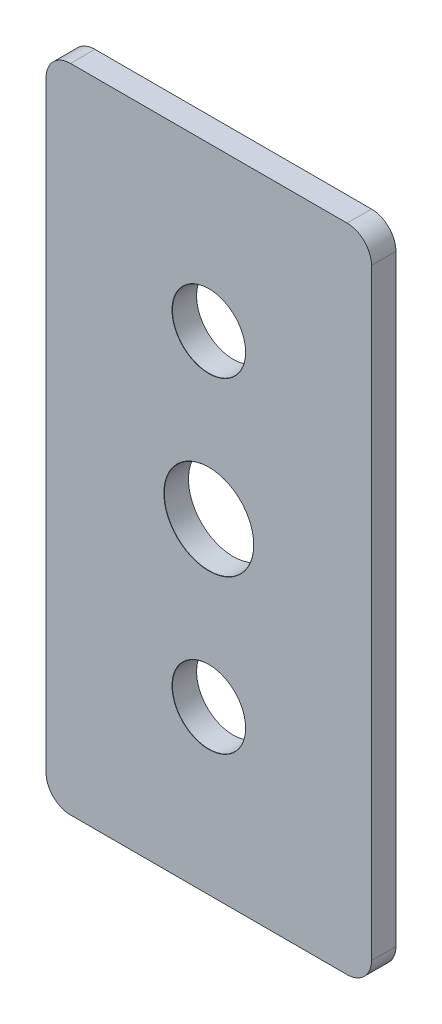
ISO-10303-21;
HEADER;
FILE_DESCRIPTION(('STEP AP214'),'2;1');
FILE_NAME('part.step','',(''),(''),'','','');
FILE_SCHEMA(('AUTOMOTIVE_DESIGN { 1 0 10303 214 1 1 1 1 }'));
ENDSEC;
DATA;
#1=APPLICATION_CONTEXT('core data for automotive mechanical design processes');
#2=APPLICATION_PROTOCOL_DEFINITION('international standard','automotive_design',2000,#1);
#3=PRODUCT_CONTEXT('',#1,'mechanical');
#4=PRODUCT('Part','Part','',(#3));
#5=PRODUCT_RELATED_PRODUCT_CATEGORY('part','',(#4));
#6=PRODUCT_DEFINITION_FORMATION('','',#4);
#7=PRODUCT_DEFINITION_CONTEXT('part definition',#1,'design');
#8=PRODUCT_DEFINITION('design','',#6,#7);
#9=PRODUCT_DEFINITION_SHAPE('','',#8);
#10=(LENGTH_UNIT() NAMED_UNIT(*) SI_UNIT(.MILLI.,.METRE.));
#11=(NAMED_UNIT(*) PLANE_ANGLE_UNIT() SI_UNIT($,.RADIAN.));
#12=(NAMED_UNIT(*) SI_UNIT($,.STERADIAN.) SOLID_ANGLE_UNIT());
#13=UNCERTAINTY_MEASURE_WITH_UNIT(LENGTH_MEASURE(1.E-05),#10,'distance_accuracy_value','');
#14=(GEOMETRIC_REPRESENTATION_CONTEXT(3) GLOBAL_UNCERTAINTY_ASSIGNED_CONTEXT((#13)) GLOBAL_UNIT_ASSIGNED_CONTEXT((#10,
#11,#12)) REPRESENTATION_CONTEXT('',''));
#15=CARTESIAN_POINT('',(0.,0.,0.));
#16=DIRECTION('',(0.,0.,1.));
#17=DIRECTION('',(1.,0.,0.));
#18=AXIS2_PLACEMENT_3D('',#15,#16,#17);
#19=CARTESIAN_POINT('',(20.,40.,-3.));
#20=DIRECTION('',(1.,0.,0.));
#21=DIRECTION('',(0.,0.,-1.));
#22=AXIS2_PLACEMENT_3D('',#19,#20,#21);
#23=PLANE('',#22);
#24=DIRECTION('',(0.,1.,0.));
#25=VECTOR('',#24,1.);
#26=CARTESIAN_POINT('',(20.,40.,0.));
#27=LINE('',#26,#25);
#28=CARTESIAN_POINT('',(20.,-37.,0.));
#29=VERTEX_POINT('',#28);
#30=CARTESIAN_POINT('',(20.,37.,0.));
#31=VERTEX_POINT('',#30);
#32=EDGE_CURVE('E171',#29,#31,#27,.T.);
#33=ORIENTED_EDGE('',*,*,#32,.F.);
#34=DIRECTION('',(0.,0.,1.));
#35=VECTOR('',#34,1.);
#36=CARTESIAN_POINT('',(20.,-37.,-3.));
#37=LINE('',#36,#35);
#38=CARTESIAN_POINT('',(20.,-37.,-3.));
#39=VERTEX_POINT('',#38);
#40=EDGE_CURVE('E156',#29,#39,#37,.F.);
#41=ORIENTED_EDGE('',*,*,#40,.T.);
#42=DIRECTION('',(0.,1.,0.));
#43=VECTOR('',#42,1.);
#44=CARTESIAN_POINT('',(20.,40.,-3.));
#45=LINE('',#44,#43);
#46=CARTESIAN_POINT('',(20.,37.,-3.));
#47=VERTEX_POINT('',#46);
#48=EDGE_CURVE('E140',#39,#47,#45,.T.);
#49=ORIENTED_EDGE('',*,*,#48,.T.);
#50=DIRECTION('',(0.,0.,1.));
#51=VECTOR('',#50,1.);
#52=CARTESIAN_POINT('',(20.,37.,-3.));
#53=LINE('',#52,#51);
#54=EDGE_CURVE('E153',#47,#31,#53,.T.);
#55=ORIENTED_EDGE('',*,*,#54,.T.);
#56=EDGE_LOOP('',(#33,#41,#49,#55));
#57=FACE_BOUND('',#56,.T.);
#58=ADVANCED_FACE('F48',(#57),#23,.T.);
#59=CARTESIAN_POINT('',(-20.,-40.,-3.));
#60=DIRECTION('',(0.,-1.,0.));
#61=DIRECTION('',(0.,0.,-1.));
#62=AXIS2_PLACEMENT_3D('',#59,#60,#61);
#63=PLANE('',#62);
#64=DIRECTION('',(1.,0.,0.));
#65=VECTOR('',#64,1.);
#66=CARTESIAN_POINT('',(-20.,-40.,-3.));
#67=LINE('',#66,#65);
#68=CARTESIAN_POINT('',(-17.,-40.,-3.));
#69=VERTEX_POINT('',#68);
#70=CARTESIAN_POINT('',(17.,-40.,-3.));
#71=VERTEX_POINT('',#70);
#72=EDGE_CURVE('E142',#69,#71,#67,.T.);
#73=ORIENTED_EDGE('',*,*,#72,.T.);
#74=DIRECTION('',(0.,0.,1.));
#75=VECTOR('',#74,1.);
#76=CARTESIAN_POINT('',(17.,-40.,-3.));
#77=LINE('',#76,#75);
#78=CARTESIAN_POINT('',(17.,-40.,0.));
#79=VERTEX_POINT('',#78);
#80=EDGE_CURVE('E136',#71,#79,#77,.T.);
#81=ORIENTED_EDGE('',*,*,#80,.T.);
#82=DIRECTION('',(1.,0.,0.));
#83=VECTOR('',#82,1.);
#84=CARTESIAN_POINT('',(-20.,-40.,0.));
#85=LINE('',#84,#83);
#86=CARTESIAN_POINT('',(-17.,-40.,0.));
#87=VERTEX_POINT('',#86);
#88=EDGE_CURVE('E118',#87,#79,#85,.T.);
#89=ORIENTED_EDGE('',*,*,#88,.F.);
#90=DIRECTION('',(0.,0.,1.));
#91=VECTOR('',#90,1.);
#92=CARTESIAN_POINT('',(-17.,-40.,-3.));
#93=LINE('',#92,#91);
#94=EDGE_CURVE('E134',#87,#69,#93,.F.);
#95=ORIENTED_EDGE('',*,*,#94,.T.);
#96=EDGE_LOOP('',(#73,#81,#89,#95));
#97=FACE_BOUND('',#96,.T.);
#98=ADVANCED_FACE('F132',(#97),#63,.T.);
#99=CARTESIAN_POINT('',(-20.,40.,-3.));
#100=DIRECTION('',(-1.,0.,0.));
#101=DIRECTION('',(0.,0.,1.));
#102=AXIS2_PLACEMENT_3D('',#99,#100,#101);
#103=PLANE('',#102);
#104=DIRECTION('',(0.,-1.,0.));
#105=VECTOR('',#104,1.);
#106=CARTESIAN_POINT('',(-20.,40.,-3.));
#107=LINE('',#106,#105);
#108=CARTESIAN_POINT('',(-20.,37.,-3.));
#109=VERTEX_POINT('',#108);
#110=CARTESIAN_POINT('',(-20.,-37.,-3.));
#111=VERTEX_POINT('',#110);
#112=EDGE_CURVE('E148',#109,#111,#107,.T.);
#113=ORIENTED_EDGE('',*,*,#112,.T.);
#114=DIRECTION('',(0.,0.,1.));
#115=VECTOR('',#114,1.);
#116=CARTESIAN_POINT('',(-20.,-37.,-3.));
#117=LINE('',#116,#115);
#118=CARTESIAN_POINT('',(-20.,-37.,0.));
#119=VERTEX_POINT('',#118);
#120=EDGE_CURVE('E167',#111,#119,#117,.T.);
#121=ORIENTED_EDGE('',*,*,#120,.T.);
#122=DIRECTION('',(0.,-1.,0.));
#123=VECTOR('',#122,1.);
#124=CARTESIAN_POINT('',(-20.,40.,0.));
#125=LINE('',#124,#123);
#126=CARTESIAN_POINT('',(-20.,37.,0.));
#127=VERTEX_POINT('',#126);
#128=EDGE_CURVE('E124',#127,#119,#125,.T.);
#129=ORIENTED_EDGE('',*,*,#128,.F.);
#130=DIRECTION('',(0.,0.,1.));
#131=VECTOR('',#130,1.);
#132=CARTESIAN_POINT('',(-20.,37.,-3.));
#133=LINE('',#132,#131);
#134=EDGE_CURVE('E163',#127,#109,#133,.F.);
#135=ORIENTED_EDGE('',*,*,#134,.T.);
#136=EDGE_LOOP('',(#113,#121,#129,#135));
#137=FACE_BOUND('',#136,.T.);
#138=ADVANCED_FACE('F216',(#137),#103,.T.);
#139=CARTESIAN_POINT('',(-20.,40.,-3.));
#140=DIRECTION('',(0.,1.,0.));
#141=DIRECTION('',(0.,0.,1.));
#142=AXIS2_PLACEMENT_3D('',#139,#140,#141);
#143=PLANE('',#142);
#144=DIRECTION('',(-1.,0.,0.));
#145=VECTOR('',#144,1.);
#146=CARTESIAN_POINT('',(-20.,40.,-3.));
#147=LINE('',#146,#145);
#148=CARTESIAN_POINT('',(17.,40.,-3.));
#149=VERTEX_POINT('',#148);
#150=CARTESIAN_POINT('',(-17.,40.,-3.));
#151=VERTEX_POINT('',#150);
#152=EDGE_CURVE('E192',#149,#151,#147,.T.);
#153=ORIENTED_EDGE('',*,*,#152,.T.);
#154=DIRECTION('',(0.,0.,1.));
#155=VECTOR('',#154,1.);
#156=CARTESIAN_POINT('',(-17.,40.,-3.));
#157=LINE('',#156,#155);
#158=CARTESIAN_POINT('',(-17.,40.,0.));
#159=VERTEX_POINT('',#158);
#160=EDGE_CURVE('E11',#151,#159,#157,.T.);
#161=ORIENTED_EDGE('',*,*,#160,.T.);
#162=DIRECTION('',(-1.,0.,0.));
#163=VECTOR('',#162,1.);
#164=CARTESIAN_POINT('',(-20.,40.,0.));
#165=LINE('',#164,#163);
#166=CARTESIAN_POINT('',(17.,40.,0.));
#167=VERTEX_POINT('',#166);
#168=EDGE_CURVE('E199',#167,#159,#165,.T.);
#169=ORIENTED_EDGE('',*,*,#168,.F.);
#170=DIRECTION('',(0.,0.,1.));
#171=VECTOR('',#170,1.);
#172=CARTESIAN_POINT('',(17.,40.,-3.));
#173=LINE('',#172,#171);
#174=EDGE_CURVE('E60',#167,#149,#173,.F.);
#175=ORIENTED_EDGE('',*,*,#174,.T.);
#176=EDGE_LOOP('',(#153,#161,#169,#175));
#177=FACE_BOUND('',#176,.T.);
#178=ADVANCED_FACE('F205',(#177),#143,.T.);
#179=CARTESIAN_POINT('',(0.,0.,-3.));
#180=DIRECTION('',(0.,0.,1.));
#181=DIRECTION('',(1.,0.,0.));
#182=AXIS2_PLACEMENT_3D('',#179,#180,#181);
#183=PLANE('',#182);
#184=CARTESIAN_POINT('',(0.,0.,-3.));
#185=DIRECTION('',(0.,0.,1.));
#186=DIRECTION('',(1.,0.,0.));
#187=AXIS2_PLACEMENT_3D('',#184,#185,#186);
#188=CIRCLE('',#187,5.5);
#189=CARTESIAN_POINT('',(5.5,0.,-3.));
#190=VERTEX_POINT('',#189);
#191=EDGE_CURVE('E55',#190,#190,#188,.T.);
#192=ORIENTED_EDGE('',*,*,#191,.T.);
#193=EDGE_LOOP('',(#192));
#194=FACE_BOUND('',#193,.T.);
#195=CARTESIAN_POINT('',(0.,20.,-3.));
#196=DIRECTION('',(0.,0.,1.));
#197=DIRECTION('',(1.,0.,0.));
#198=AXIS2_PLACEMENT_3D('',#195,#196,#197);
#199=CIRCLE('',#198,4.5);
#200=CARTESIAN_POINT('',(4.5,20.,-3.));
#201=VERTEX_POINT('',#200);
#202=EDGE_CURVE('E174',#201,#201,#199,.T.);
#203=ORIENTED_EDGE('',*,*,#202,.T.);
#204=EDGE_LOOP('',(#203));
#205=FACE_BOUND('',#204,.T.);
#206=CARTESIAN_POINT('',(0.,-20.,-3.));
#207=DIRECTION('',(0.,0.,1.));
#208=DIRECTION('',(1.,0.,0.));
#209=AXIS2_PLACEMENT_3D('',#206,#207,#208);
#210=CIRCLE('',#209,4.5);
#211=CARTESIAN_POINT('',(4.5,-20.,-3.));
#212=VERTEX_POINT('',#211);
#213=EDGE_CURVE('E166',#212,#212,#210,.T.);
#214=ORIENTED_EDGE('',*,*,#213,.T.);
#215=EDGE_LOOP('',(#214));
#216=FACE_BOUND('',#215,.T.);
#217=ORIENTED_EDGE('',*,*,#48,.F.);
#218=CARTESIAN_POINT('',(17.,-37.,-3.));
#219=DIRECTION('',(0.,0.,1.));
#220=DIRECTION('',(1.,0.,0.));
#221=AXIS2_PLACEMENT_3D('',#218,#219,#220);
#222=CIRCLE('',#221,3.);
#223=EDGE_CURVE('E165',#39,#71,#222,.F.);
#224=ORIENTED_EDGE('',*,*,#223,.T.);
#225=ORIENTED_EDGE('',*,*,#72,.F.);
#226=CARTESIAN_POINT('',(-17.,-37.,-3.));
#227=DIRECTION('',(0.,0.,1.));
#228=DIRECTION('',(1.,0.,0.));
#229=AXIS2_PLACEMENT_3D('',#226,#227,#228);
#230=CIRCLE('',#229,3.);
#231=EDGE_CURVE('E143',#69,#111,#230,.F.);
#232=ORIENTED_EDGE('',*,*,#231,.T.);
#233=ORIENTED_EDGE('',*,*,#112,.F.);
#234=CARTESIAN_POINT('',(-17.,37.,-3.));
#235=DIRECTION('',(0.,0.,1.));
#236=DIRECTION('',(1.,0.,0.));
#237=AXIS2_PLACEMENT_3D('',#234,#235,#236);
#238=CIRCLE('',#237,3.);
#239=EDGE_CURVE('E65',#109,#151,#238,.F.);
#240=ORIENTED_EDGE('',*,*,#239,.T.);
#241=ORIENTED_EDGE('',*,*,#152,.F.);
#242=CARTESIAN_POINT('',(17.,37.,-3.));
#243=DIRECTION('',(0.,0.,1.));
#244=DIRECTION('',(1.,0.,0.));
#245=AXIS2_PLACEMENT_3D('',#242,#243,#244);
#246=CIRCLE('',#245,3.);
#247=EDGE_CURVE('E158',#149,#47,#246,.F.);
#248=ORIENTED_EDGE('',*,*,#247,.T.);
#249=EDGE_LOOP('',(#217,#224,#225,#232,#233,#240,#241,#248));
#250=FACE_BOUND('',#249,.T.);
#251=ADVANCED_FACE('F208',(#194,#205,#216,#250),#183,.F.);
#252=CARTESIAN_POINT('',(0.,0.,0.));
#253=DIRECTION('',(0.,0.,1.));
#254=DIRECTION('',(1.,0.,0.));
#255=AXIS2_PLACEMENT_3D('',#252,#253,#254);
#256=PLANE('',#255);
#257=CARTESIAN_POINT('',(0.,0.,0.));
#258=DIRECTION('',(0.,0.,1.));
#259=DIRECTION('',(1.,0.,0.));
#260=AXIS2_PLACEMENT_3D('',#257,#258,#259);
#261=CIRCLE('',#260,5.525);
#262=CARTESIAN_POINT('',(5.525,0.,0.));
#263=VERTEX_POINT('',#262);
#264=EDGE_CURVE('E361',#263,#263,#261,.T.);
#265=ORIENTED_EDGE('',*,*,#264,.F.);
#266=EDGE_LOOP('',(#265));
#267=FACE_BOUND('',#266,.T.);
#268=CARTESIAN_POINT('',(0.,20.,0.));
#269=DIRECTION('',(0.,0.,1.));
#270=DIRECTION('',(1.,0.,0.));
#271=AXIS2_PLACEMENT_3D('',#268,#269,#270);
#272=CIRCLE('',#271,4.525);
#273=CARTESIAN_POINT('',(4.525,20.,0.));
#274=VERTEX_POINT('',#273);
#275=EDGE_CURVE('E185',#274,#274,#272,.T.);
#276=ORIENTED_EDGE('',*,*,#275,.F.);
#277=EDGE_LOOP('',(#276));
#278=FACE_BOUND('',#277,.T.);
#279=CARTESIAN_POINT('',(0.,-20.,0.));
#280=DIRECTION('',(0.,0.,1.));
#281=DIRECTION('',(1.,0.,0.));
#282=AXIS2_PLACEMENT_3D('',#279,#280,#281);
#283=CIRCLE('',#282,4.525);
#284=CARTESIAN_POINT('',(4.525,-20.,0.));
#285=VERTEX_POINT('',#284);
#286=EDGE_CURVE('E175',#285,#285,#283,.T.);
#287=ORIENTED_EDGE('',*,*,#286,.F.);
#288=EDGE_LOOP('',(#287));
#289=FACE_BOUND('',#288,.T.);
#290=ORIENTED_EDGE('',*,*,#88,.T.);
#291=CARTESIAN_POINT('',(17.,-37.,0.));
#292=DIRECTION('',(0.,0.,1.));
#293=DIRECTION('',(1.,0.,0.));
#294=AXIS2_PLACEMENT_3D('',#291,#292,#293);
#295=CIRCLE('',#294,3.);
#296=EDGE_CURVE('E127',#79,#29,#295,.T.);
#297=ORIENTED_EDGE('',*,*,#296,.T.);
#298=ORIENTED_EDGE('',*,*,#32,.T.);
#299=CARTESIAN_POINT('',(17.,37.,0.));
#300=DIRECTION('',(0.,0.,1.));
#301=DIRECTION('',(1.,0.,0.));
#302=AXIS2_PLACEMENT_3D('',#299,#300,#301);
#303=CIRCLE('',#302,3.);
#304=EDGE_CURVE('E145',#31,#167,#303,.T.);
#305=ORIENTED_EDGE('',*,*,#304,.T.);
#306=ORIENTED_EDGE('',*,*,#168,.T.);
#307=CARTESIAN_POINT('',(-17.,37.,0.));
#308=DIRECTION('',(0.,0.,1.));
#309=DIRECTION('',(1.,0.,0.));
#310=AXIS2_PLACEMENT_3D('',#307,#308,#309);
#311=CIRCLE('',#310,3.);
#312=EDGE_CURVE('E130',#159,#127,#311,.T.);
#313=ORIENTED_EDGE('',*,*,#312,.T.);
#314=ORIENTED_EDGE('',*,*,#128,.T.);
#315=CARTESIAN_POINT('',(-17.,-37.,0.));
#316=DIRECTION('',(0.,0.,1.));
#317=DIRECTION('',(1.,0.,0.));
#318=AXIS2_PLACEMENT_3D('',#315,#316,#317);
#319=CIRCLE('',#318,3.);
#320=EDGE_CURVE('E116',#119,#87,#319,.T.);
#321=ORIENTED_EDGE('',*,*,#320,.T.);
#322=EDGE_LOOP('',(#290,#297,#298,#305,#306,#313,#314,#321));
#323=FACE_BOUND('',#322,.T.);
#324=ADVANCED_FACE('F119',(#267,#278,#289,#323),#256,.T.);
#325=CARTESIAN_POINT('',(17.,-37.,-3.));
#326=DIRECTION('',(0.,0.,1.));
#327=DIRECTION('',(1.,0.,0.));
#328=AXIS2_PLACEMENT_3D('',#325,#326,#327);
#329=CYLINDRICAL_SURFACE('',#328,3.);
#330=ORIENTED_EDGE('',*,*,#223,.F.);
#331=ORIENTED_EDGE('',*,*,#40,.F.);
#332=ORIENTED_EDGE('',*,*,#296,.F.);
#333=ORIENTED_EDGE('',*,*,#80,.F.);
#334=EDGE_LOOP('',(#330,#331,#332,#333));
#335=FACE_BOUND('',#334,.T.);
#336=ADVANCED_FACE('F212',(#335),#329,.T.);
#337=CARTESIAN_POINT('',(-17.,-37.,-3.));
#338=DIRECTION('',(0.,0.,1.));
#339=DIRECTION('',(1.,0.,0.));
#340=AXIS2_PLACEMENT_3D('',#337,#338,#339);
#341=CYLINDRICAL_SURFACE('',#340,3.);
#342=ORIENTED_EDGE('',*,*,#231,.F.);
#343=ORIENTED_EDGE('',*,*,#94,.F.);
#344=ORIENTED_EDGE('',*,*,#320,.F.);
#345=ORIENTED_EDGE('',*,*,#120,.F.);
#346=EDGE_LOOP('',(#342,#343,#344,#345));
#347=FACE_BOUND('',#346,.T.);
#348=ADVANCED_FACE('F139',(#347),#341,.T.);
#349=CARTESIAN_POINT('',(-17.,37.,-3.));
#350=DIRECTION('',(0.,0.,1.));
#351=DIRECTION('',(1.,0.,0.));
#352=AXIS2_PLACEMENT_3D('',#349,#350,#351);
#353=CYLINDRICAL_SURFACE('',#352,3.);
#354=ORIENTED_EDGE('',*,*,#239,.F.);
#355=ORIENTED_EDGE('',*,*,#134,.F.);
#356=ORIENTED_EDGE('',*,*,#312,.F.);
#357=ORIENTED_EDGE('',*,*,#160,.F.);
#358=EDGE_LOOP('',(#354,#355,#356,#357));
#359=FACE_BOUND('',#358,.T.);
#360=ADVANCED_FACE('F218',(#359),#353,.T.);
#361=CARTESIAN_POINT('',(17.,37.,-3.));
#362=DIRECTION('',(0.,0.,1.));
#363=DIRECTION('',(1.,0.,0.));
#364=AXIS2_PLACEMENT_3D('',#361,#362,#363);
#365=CYLINDRICAL_SURFACE('',#364,3.);
#366=ORIENTED_EDGE('',*,*,#247,.F.);
#367=ORIENTED_EDGE('',*,*,#174,.F.);
#368=ORIENTED_EDGE('',*,*,#304,.F.);
#369=ORIENTED_EDGE('',*,*,#54,.F.);
#370=EDGE_LOOP('',(#366,#367,#368,#369));
#371=FACE_BOUND('',#370,.T.);
#372=ADVANCED_FACE('F49',(#371),#365,.T.);
#373=CARTESIAN_POINT('',(0.,-20.,0.));
#374=DIRECTION('',(0.,0.,1.));
#375=DIRECTION('',(1.,0.,0.));
#376=AXIS2_PLACEMENT_3D('',#373,#374,#375);
#377=CYLINDRICAL_SURFACE('',#376,4.5);
#378=CARTESIAN_POINT('',(0.,-20.,-0.0250000000000059));
#379=DIRECTION('',(0.,0.,1.));
#380=DIRECTION('',(1.,0.,0.));
#381=AXIS2_PLACEMENT_3D('',#378,#379,#380);
#382=CIRCLE('',#381,4.5);
#383=CARTESIAN_POINT('',(4.5,-20.,-0.0250000000000059));
#384=VERTEX_POINT('',#383);
#385=EDGE_CURVE('E172',#384,#384,#382,.T.);
#386=ORIENTED_EDGE('',*,*,#385,.T.);
#387=EDGE_LOOP('',(#386));
#388=FACE_BOUND('',#387,.T.);
#389=ORIENTED_EDGE('',*,*,#213,.F.);
#390=EDGE_LOOP('',(#389));
#391=FACE_BOUND('',#390,.T.);
#392=ADVANCED_FACE('F223',(#388,#391),#377,.F.);
#393=CARTESIAN_POINT('',(0.,-20.,0.));
#394=DIRECTION('',(0.,0.,1.));
#395=DIRECTION('',(1.,0.,0.));
#396=AXIS2_PLACEMENT_3D('',#393,#394,#395);
#397=CONICAL_SURFACE('',#396,4.525,0.785398163397379);
#398=ORIENTED_EDGE('',*,*,#385,.F.);
#399=EDGE_LOOP('',(#398));
#400=FACE_BOUND('',#399,.T.);
#401=ORIENTED_EDGE('',*,*,#286,.T.);
#402=EDGE_LOOP('',(#401));
#403=FACE_BOUND('',#402,.T.);
#404=ADVANCED_FACE('F310',(#400,#403),#397,.F.);
#405=CARTESIAN_POINT('',(0.,20.,0.));
#406=DIRECTION('',(0.,0.,1.));
#407=DIRECTION('',(1.,0.,0.));
#408=AXIS2_PLACEMENT_3D('',#405,#406,#407);
#409=CYLINDRICAL_SURFACE('',#408,4.5);
#410=CARTESIAN_POINT('',(0.,20.,-0.0250000000000059));
#411=DIRECTION('',(0.,0.,1.));
#412=DIRECTION('',(1.,0.,0.));
#413=AXIS2_PLACEMENT_3D('',#410,#411,#412);
#414=CIRCLE('',#413,4.5);
#415=CARTESIAN_POINT('',(4.5,20.,-0.0250000000000059));
#416=VERTEX_POINT('',#415);
#417=EDGE_CURVE('E179',#416,#416,#414,.T.);
#418=ORIENTED_EDGE('',*,*,#417,.T.);
#419=EDGE_LOOP('',(#418));
#420=FACE_BOUND('',#419,.T.);
#421=ORIENTED_EDGE('',*,*,#202,.F.);
#422=EDGE_LOOP('',(#421));
#423=FACE_BOUND('',#422,.T.);
#424=ADVANCED_FACE('F318',(#420,#423),#409,.F.);
#425=CARTESIAN_POINT('',(0.,20.,0.));
#426=DIRECTION('',(0.,0.,1.));
#427=DIRECTION('',(1.,0.,0.));
#428=AXIS2_PLACEMENT_3D('',#425,#426,#427);
#429=CONICAL_SURFACE('',#428,4.525,0.785398163397379);
#430=ORIENTED_EDGE('',*,*,#417,.F.);
#431=EDGE_LOOP('',(#430));
#432=FACE_BOUND('',#431,.T.);
#433=ORIENTED_EDGE('',*,*,#275,.T.);
#434=EDGE_LOOP('',(#433));
#435=FACE_BOUND('',#434,.T.);
#436=ADVANCED_FACE('F327',(#432,#435),#429,.F.);
#437=CARTESIAN_POINT('',(0.,0.,0.));
#438=DIRECTION('',(0.,0.,1.));
#439=DIRECTION('',(1.,0.,0.));
#440=AXIS2_PLACEMENT_3D('',#437,#438,#439);
#441=CYLINDRICAL_SURFACE('',#440,5.5);
#442=CARTESIAN_POINT('',(0.,0.,-0.0250000000000042));
#443=DIRECTION('',(0.,0.,1.));
#444=DIRECTION('',(1.,0.,0.));
#445=AXIS2_PLACEMENT_3D('',#442,#443,#444);
#446=CIRCLE('',#445,5.5);
#447=CARTESIAN_POINT('',(5.5,0.,-0.0250000000000042));
#448=VERTEX_POINT('',#447);
#449=EDGE_CURVE('E363',#448,#448,#446,.T.);
#450=ORIENTED_EDGE('',*,*,#449,.T.);
#451=EDGE_LOOP('',(#450));
#452=FACE_BOUND('',#451,.T.);
#453=ORIENTED_EDGE('',*,*,#191,.F.);
#454=EDGE_LOOP('',(#453));
#455=FACE_BOUND('',#454,.T.);
#456=ADVANCED_FACE('F336',(#452,#455),#441,.F.);
#457=CARTESIAN_POINT('',(0.,0.,0.));
#458=DIRECTION('',(0.,0.,1.));
#459=DIRECTION('',(1.,0.,0.));
#460=AXIS2_PLACEMENT_3D('',#457,#458,#459);
#461=CONICAL_SURFACE('',#460,5.525,0.785398163397414);
#462=ORIENTED_EDGE('',*,*,#449,.F.);
#463=EDGE_LOOP('',(#462));
#464=FACE_BOUND('',#463,.T.);
#465=ORIENTED_EDGE('',*,*,#264,.T.);
#466=EDGE_LOOP('',(#465));
#467=FACE_BOUND('',#466,.T.);
#468=ADVANCED_FACE('F342',(#464,#467),#461,.F.);
#469=CLOSED_SHELL('',(#58,#98,#138,#178,#251,#324,#336,#348,#360,#372,#392,#404,#424,#436,#456,#468));
#470=MANIFOLD_SOLID_BREP('B2',#469);
#471=ADVANCED_BREP_SHAPE_REPRESENTATION('',(#18,#470),#14);
#472=SHAPE_DEFINITION_REPRESENTATION(#9,#471);
ENDSEC;
END-ISO-10303-21;
